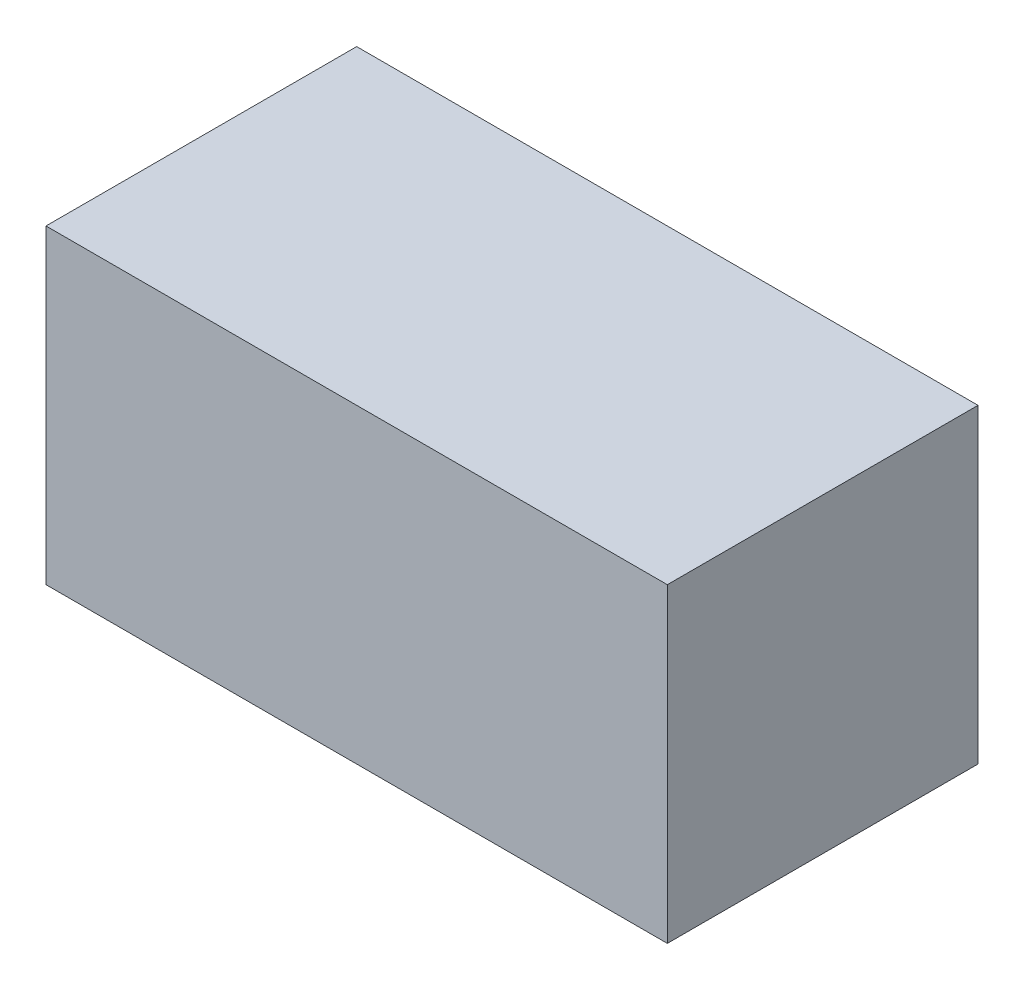
ISO-10303-21;
HEADER;
FILE_DESCRIPTION(('STEP AP214'),'2;1');
FILE_NAME('part.step','',(''),(''),'','','');
FILE_SCHEMA(('AUTOMOTIVE_DESIGN { 1 0 10303 214 1 1 1 1 }'));
ENDSEC;
DATA;
#1=APPLICATION_CONTEXT('core data for automotive mechanical design processes');
#2=APPLICATION_PROTOCOL_DEFINITION('international standard','automotive_design',2000,#1);
#3=PRODUCT_CONTEXT('',#1,'mechanical');
#4=PRODUCT('Part','Part','',(#3));
#5=PRODUCT_RELATED_PRODUCT_CATEGORY('part','',(#4));
#6=PRODUCT_DEFINITION_FORMATION('','',#4);
#7=PRODUCT_DEFINITION_CONTEXT('part definition',#1,'design');
#8=PRODUCT_DEFINITION('design','',#6,#7);
#9=PRODUCT_DEFINITION_SHAPE('','',#8);
#10=(LENGTH_UNIT() NAMED_UNIT(*) SI_UNIT(.MILLI.,.METRE.));
#11=(NAMED_UNIT(*) PLANE_ANGLE_UNIT() SI_UNIT($,.RADIAN.));
#12=(NAMED_UNIT(*) SI_UNIT($,.STERADIAN.) SOLID_ANGLE_UNIT());
#13=UNCERTAINTY_MEASURE_WITH_UNIT(LENGTH_MEASURE(1.E-05),#10,'distance_accuracy_value','');
#14=(GEOMETRIC_REPRESENTATION_CONTEXT(3) GLOBAL_UNCERTAINTY_ASSIGNED_CONTEXT((#13)) GLOBAL_UNIT_ASSIGNED_CONTEXT((#10,
#11,#12)) REPRESENTATION_CONTEXT('',''));
#15=CARTESIAN_POINT('',(0.,0.,0.));
#16=DIRECTION('',(0.,0.,1.));
#17=DIRECTION('',(1.,0.,0.));
#18=AXIS2_PLACEMENT_3D('',#15,#16,#17);
#19=CARTESIAN_POINT('',(0.,0.762,0.));
#20=DIRECTION('',(1.,0.,0.));
#21=DIRECTION('',(0.,0.,-1.));
#22=AXIS2_PLACEMENT_3D('',#19,#20,#21);
#23=PLANE('',#22);
#24=DIRECTION('',(0.,0.,1.));
#25=VECTOR('',#24,1.);
#26=CARTESIAN_POINT('',(0.,0.,0.));
#27=LINE('',#26,#25);
#28=CARTESIAN_POINT('',(0.,0.,-0.762));
#29=VERTEX_POINT('',#28);
#30=CARTESIAN_POINT('',(0.,0.,0.));
#31=VERTEX_POINT('',#30);
#32=EDGE_CURVE('E96',#29,#31,#27,.T.);
#33=ORIENTED_EDGE('',*,*,#32,.T.);
#34=DIRECTION('',(0.,-1.,0.));
#35=VECTOR('',#34,1.);
#36=CARTESIAN_POINT('',(0.,0.762,0.));
#37=LINE('',#36,#35);
#38=CARTESIAN_POINT('',(0.,0.762,0.));
#39=VERTEX_POINT('',#38);
#40=EDGE_CURVE('E11',#39,#31,#37,.T.);
#41=ORIENTED_EDGE('',*,*,#40,.F.);
#42=DIRECTION('',(0.,0.,1.));
#43=VECTOR('',#42,1.);
#44=CARTESIAN_POINT('',(0.,0.762,0.));
#45=LINE('',#44,#43);
#46=CARTESIAN_POINT('',(0.,0.762,-0.762));
#47=VERTEX_POINT('',#46);
#48=EDGE_CURVE('E84',#47,#39,#45,.T.);
#49=ORIENTED_EDGE('',*,*,#48,.F.);
#50=DIRECTION('',(0.,-1.,0.));
#51=VECTOR('',#50,1.);
#52=CARTESIAN_POINT('',(0.,0.762,-0.762));
#53=LINE('',#52,#51);
#54=EDGE_CURVE('E92',#47,#29,#53,.T.);
#55=ORIENTED_EDGE('',*,*,#54,.T.);
#56=EDGE_LOOP('',(#33,#41,#49,#55));
#57=FACE_BOUND('',#56,.T.);
#58=ADVANCED_FACE('F33',(#57),#23,.F.);
#59=CARTESIAN_POINT('',(0.,0.762,0.));
#60=DIRECTION('',(0.,0.,-1.));
#61=DIRECTION('',(-1.,0.,0.));
#62=AXIS2_PLACEMENT_3D('',#59,#60,#61);
#63=PLANE('',#62);
#64=DIRECTION('',(1.,0.,0.));
#65=VECTOR('',#64,1.);
#66=CARTESIAN_POINT('',(0.,0.,0.));
#67=LINE('',#66,#65);
#68=CARTESIAN_POINT('',(1.524,0.,0.));
#69=VERTEX_POINT('',#68);
#70=EDGE_CURVE('E88',#31,#69,#67,.T.);
#71=ORIENTED_EDGE('',*,*,#70,.T.);
#72=DIRECTION('',(0.,-1.,0.));
#73=VECTOR('',#72,1.);
#74=CARTESIAN_POINT('',(1.524,0.762,0.));
#75=LINE('',#74,#73);
#76=CARTESIAN_POINT('',(1.524,0.762,0.));
#77=VERTEX_POINT('',#76);
#78=EDGE_CURVE('E41',#77,#69,#75,.T.);
#79=ORIENTED_EDGE('',*,*,#78,.F.);
#80=DIRECTION('',(1.,0.,0.));
#81=VECTOR('',#80,1.);
#82=CARTESIAN_POINT('',(0.,0.762,0.));
#83=LINE('',#82,#81);
#84=EDGE_CURVE('E79',#39,#77,#83,.T.);
#85=ORIENTED_EDGE('',*,*,#84,.F.);
#86=ORIENTED_EDGE('',*,*,#40,.T.);
#87=EDGE_LOOP('',(#71,#79,#85,#86));
#88=FACE_BOUND('',#87,.T.);
#89=ADVANCED_FACE('F87',(#88),#63,.F.);
#90=CARTESIAN_POINT('',(1.524,0.762,0.));
#91=DIRECTION('',(-1.,0.,0.));
#92=DIRECTION('',(0.,0.,1.));
#93=AXIS2_PLACEMENT_3D('',#90,#91,#92);
#94=PLANE('',#93);
#95=DIRECTION('',(0.,0.,-1.));
#96=VECTOR('',#95,1.);
#97=CARTESIAN_POINT('',(1.524,0.,0.));
#98=LINE('',#97,#96);
#99=CARTESIAN_POINT('',(1.524,0.,-0.762));
#100=VERTEX_POINT('',#99);
#101=EDGE_CURVE('E66',#69,#100,#98,.T.);
#102=ORIENTED_EDGE('',*,*,#101,.T.);
#103=DIRECTION('',(0.,-1.,0.));
#104=VECTOR('',#103,1.);
#105=CARTESIAN_POINT('',(1.524,0.762,-0.762));
#106=LINE('',#105,#104);
#107=CARTESIAN_POINT('',(1.524,0.762,-0.762));
#108=VERTEX_POINT('',#107);
#109=EDGE_CURVE('E89',#108,#100,#106,.T.);
#110=ORIENTED_EDGE('',*,*,#109,.F.);
#111=DIRECTION('',(0.,0.,-1.));
#112=VECTOR('',#111,1.);
#113=CARTESIAN_POINT('',(1.524,0.762,0.));
#114=LINE('',#113,#112);
#115=EDGE_CURVE('E82',#77,#108,#114,.T.);
#116=ORIENTED_EDGE('',*,*,#115,.F.);
#117=ORIENTED_EDGE('',*,*,#78,.T.);
#118=EDGE_LOOP('',(#102,#110,#116,#117));
#119=FACE_BOUND('',#118,.T.);
#120=ADVANCED_FACE('F90',(#119),#94,.F.);
#121=CARTESIAN_POINT('',(0.,0.762,-0.762));
#122=DIRECTION('',(0.,0.,1.));
#123=DIRECTION('',(1.,0.,0.));
#124=AXIS2_PLACEMENT_3D('',#121,#122,#123);
#125=PLANE('',#124);
#126=DIRECTION('',(-1.,0.,0.));
#127=VECTOR('',#126,1.);
#128=CARTESIAN_POINT('',(0.,0.,-0.762));
#129=LINE('',#128,#127);
#130=EDGE_CURVE('E72',#100,#29,#129,.T.);
#131=ORIENTED_EDGE('',*,*,#130,.T.);
#132=ORIENTED_EDGE('',*,*,#54,.F.);
#133=DIRECTION('',(-1.,0.,0.));
#134=VECTOR('',#133,1.);
#135=CARTESIAN_POINT('',(0.,0.762,-0.762));
#136=LINE('',#135,#134);
#137=EDGE_CURVE('E49',#108,#47,#136,.T.);
#138=ORIENTED_EDGE('',*,*,#137,.F.);
#139=ORIENTED_EDGE('',*,*,#109,.T.);
#140=EDGE_LOOP('',(#131,#132,#138,#139));
#141=FACE_BOUND('',#140,.T.);
#142=ADVANCED_FACE('F103',(#141),#125,.F.);
#143=CARTESIAN_POINT('',(0.,0.762,0.));
#144=DIRECTION('',(0.,-1.,0.));
#145=DIRECTION('',(0.,0.,-1.));
#146=AXIS2_PLACEMENT_3D('',#143,#144,#145);
#147=PLANE('',#146);
#148=ORIENTED_EDGE('',*,*,#48,.T.);
#149=ORIENTED_EDGE('',*,*,#84,.T.);
#150=ORIENTED_EDGE('',*,*,#115,.T.);
#151=ORIENTED_EDGE('',*,*,#137,.T.);
#152=EDGE_LOOP('',(#148,#149,#150,#151));
#153=FACE_BOUND('',#152,.T.);
#154=ADVANCED_FACE('F80',(#153),#147,.F.);
#155=CARTESIAN_POINT('',(0.,0.,0.));
#156=DIRECTION('',(0.,-1.,0.));
#157=DIRECTION('',(0.,0.,-1.));
#158=AXIS2_PLACEMENT_3D('',#155,#156,#157);
#159=PLANE('',#158);
#160=ORIENTED_EDGE('',*,*,#32,.F.);
#161=ORIENTED_EDGE('',*,*,#130,.F.);
#162=ORIENTED_EDGE('',*,*,#101,.F.);
#163=ORIENTED_EDGE('',*,*,#70,.F.);
#164=EDGE_LOOP('',(#160,#161,#162,#163));
#165=FACE_BOUND('',#164,.T.);
#166=ADVANCED_FACE('F106',(#165),#159,.T.);
#167=CLOSED_SHELL('',(#58,#89,#120,#142,#154,#166));
#168=MANIFOLD_SOLID_BREP('B2',#167);
#169=ADVANCED_BREP_SHAPE_REPRESENTATION('',(#18,#168),#14);
#170=SHAPE_DEFINITION_REPRESENTATION(#9,#169);
ENDSEC;
END-ISO-10303-21;
